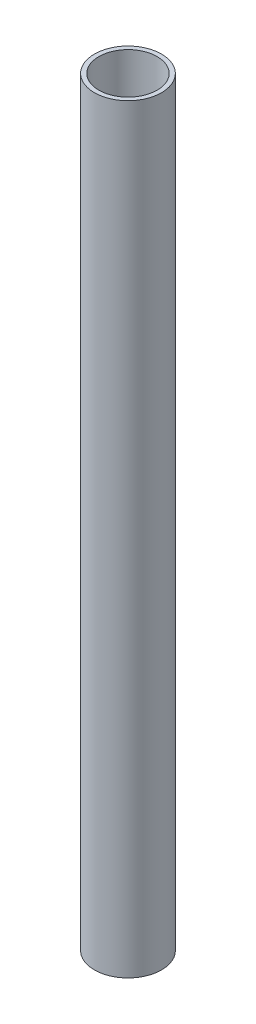
ISO-10303-21;
HEADER;
FILE_DESCRIPTION(('STEP AP214'),'2;1');
FILE_NAME('part.step','',(''),(''),'','','');
FILE_SCHEMA(('AUTOMOTIVE_DESIGN { 1 0 10303 214 1 1 1 1 }'));
ENDSEC;
DATA;
#1=APPLICATION_CONTEXT('core data for automotive mechanical design processes');
#2=APPLICATION_PROTOCOL_DEFINITION('international standard','automotive_design',2000,#1);
#3=PRODUCT_CONTEXT('',#1,'mechanical');
#4=PRODUCT('Part','Part','',(#3));
#5=PRODUCT_RELATED_PRODUCT_CATEGORY('part','',(#4));
#6=PRODUCT_DEFINITION_FORMATION('','',#4);
#7=PRODUCT_DEFINITION_CONTEXT('part definition',#1,'design');
#8=PRODUCT_DEFINITION('design','',#6,#7);
#9=PRODUCT_DEFINITION_SHAPE('','',#8);
#10=(LENGTH_UNIT() NAMED_UNIT(*) SI_UNIT(.MILLI.,.METRE.));
#11=(NAMED_UNIT(*) PLANE_ANGLE_UNIT() SI_UNIT($,.RADIAN.));
#12=(NAMED_UNIT(*) SI_UNIT($,.STERADIAN.) SOLID_ANGLE_UNIT());
#13=UNCERTAINTY_MEASURE_WITH_UNIT(LENGTH_MEASURE(1.E-05),#10,'distance_accuracy_value','');
#14=(GEOMETRIC_REPRESENTATION_CONTEXT(3) GLOBAL_UNCERTAINTY_ASSIGNED_CONTEXT((#13)) GLOBAL_UNIT_ASSIGNED_CONTEXT((#10,
#11,#12)) REPRESENTATION_CONTEXT('',''));
#15=CARTESIAN_POINT('',(0.,0.,0.));
#16=DIRECTION('',(0.,0.,1.));
#17=DIRECTION('',(1.,0.,0.));
#18=AXIS2_PLACEMENT_3D('',#15,#16,#17);
#19=CARTESIAN_POINT('',(0.,107.95,0.));
#20=DIRECTION('',(0.,1.,0.));
#21=DIRECTION('',(0.,0.,1.));
#22=AXIS2_PLACEMENT_3D('',#19,#20,#21);
#23=PLANE('',#22);
#24=CARTESIAN_POINT('',(0.,107.95,0.));
#25=DIRECTION('',(0.,1.,0.));
#26=DIRECTION('',(0.,0.,1.));
#27=AXIS2_PLACEMENT_3D('',#24,#25,#26);
#28=CIRCLE('',#27,9.525);
#29=CARTESIAN_POINT('',(0.,107.95,9.525));
#30=VERTEX_POINT('',#29);
#31=EDGE_CURVE('E10',#30,#30,#28,.T.);
#32=ORIENTED_EDGE('',*,*,#31,.T.);
#33=EDGE_LOOP('',(#32));
#34=FACE_BOUND('',#33,.T.);
#35=CARTESIAN_POINT('',(0.,107.95,0.));
#36=DIRECTION('',(0.,1.,0.));
#37=DIRECTION('',(0.,0.,1.));
#38=AXIS2_PLACEMENT_3D('',#35,#36,#37);
#39=CIRCLE('',#38,8.2804);
#40=CARTESIAN_POINT('',(0.,107.95,8.2804));
#41=VERTEX_POINT('',#40);
#42=EDGE_CURVE('E41',#41,#41,#39,.T.);
#43=ORIENTED_EDGE('',*,*,#42,.F.);
#44=EDGE_LOOP('',(#43));
#45=FACE_BOUND('',#44,.T.);
#46=ADVANCED_FACE('F30',(#34,#45),#23,.T.);
#47=CARTESIAN_POINT('',(0.,-107.95,0.));
#48=DIRECTION('',(0.,1.,0.));
#49=DIRECTION('',(0.,0.,1.));
#50=AXIS2_PLACEMENT_3D('',#47,#48,#49);
#51=PLANE('',#50);
#52=CARTESIAN_POINT('',(0.,-107.95,0.));
#53=DIRECTION('',(0.,1.,0.));
#54=DIRECTION('',(0.,0.,1.));
#55=AXIS2_PLACEMENT_3D('',#52,#53,#54);
#56=CIRCLE('',#55,9.525);
#57=CARTESIAN_POINT('',(0.,-107.95,9.525));
#58=VERTEX_POINT('',#57);
#59=EDGE_CURVE('E34',#58,#58,#56,.T.);
#60=ORIENTED_EDGE('',*,*,#59,.F.);
#61=EDGE_LOOP('',(#60));
#62=FACE_BOUND('',#61,.T.);
#63=CARTESIAN_POINT('',(0.,-107.95,0.));
#64=DIRECTION('',(0.,1.,0.));
#65=DIRECTION('',(0.,0.,1.));
#66=AXIS2_PLACEMENT_3D('',#63,#64,#65);
#67=CIRCLE('',#66,8.2804);
#68=CARTESIAN_POINT('',(0.,-107.95,8.2804));
#69=VERTEX_POINT('',#68);
#70=EDGE_CURVE('E43',#69,#69,#67,.T.);
#71=ORIENTED_EDGE('',*,*,#70,.T.);
#72=EDGE_LOOP('',(#71));
#73=FACE_BOUND('',#72,.T.);
#74=ADVANCED_FACE('F53',(#62,#73),#51,.F.);
#75=CARTESIAN_POINT('',(0.,107.95,0.));
#76=DIRECTION('',(0.,-1.,0.));
#77=DIRECTION('',(0.,0.,-1.));
#78=AXIS2_PLACEMENT_3D('',#75,#76,#77);
#79=CYLINDRICAL_SURFACE('',#78,9.525);
#80=ORIENTED_EDGE('',*,*,#31,.F.);
#81=EDGE_LOOP('',(#80));
#82=FACE_BOUND('',#81,.T.);
#83=ORIENTED_EDGE('',*,*,#59,.T.);
#84=EDGE_LOOP('',(#83));
#85=FACE_BOUND('',#84,.T.);
#86=ADVANCED_FACE('F32',(#82,#85),#79,.T.);
#87=CARTESIAN_POINT('',(0.,107.95,0.));
#88=DIRECTION('',(0.,-1.,0.));
#89=DIRECTION('',(0.,0.,-1.));
#90=AXIS2_PLACEMENT_3D('',#87,#88,#89);
#91=CYLINDRICAL_SURFACE('',#90,8.2804);
#92=ORIENTED_EDGE('',*,*,#42,.T.);
#93=EDGE_LOOP('',(#92));
#94=FACE_BOUND('',#93,.T.);
#95=ORIENTED_EDGE('',*,*,#70,.F.);
#96=EDGE_LOOP('',(#95));
#97=FACE_BOUND('',#96,.T.);
#98=ADVANCED_FACE('F49',(#94,#97),#91,.F.);
#99=CLOSED_SHELL('',(#46,#74,#86,#98));
#100=MANIFOLD_SOLID_BREP('B2',#99);
#101=ADVANCED_BREP_SHAPE_REPRESENTATION('',(#18,#100),#14);
#102=SHAPE_DEFINITION_REPRESENTATION(#9,#101);
ENDSEC;
END-ISO-10303-21;
